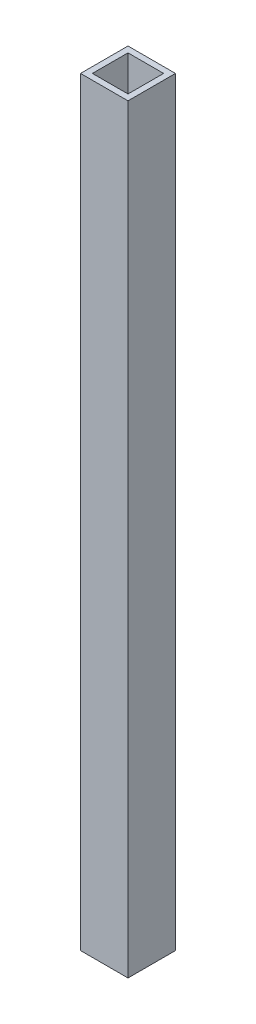
ISO-10303-21;
HEADER;
FILE_DESCRIPTION(('STEP AP214'),'2;1');
FILE_NAME('part.step','',(''),(''),'','','');
FILE_SCHEMA(('AUTOMOTIVE_DESIGN { 1 0 10303 214 1 1 1 1 }'));
ENDSEC;
DATA;
#1=APPLICATION_CONTEXT('core data for automotive mechanical design processes');
#2=APPLICATION_PROTOCOL_DEFINITION('international standard','automotive_design',2000,#1);
#3=PRODUCT_CONTEXT('',#1,'mechanical');
#4=PRODUCT('Part','Part','',(#3));
#5=PRODUCT_RELATED_PRODUCT_CATEGORY('part','',(#4));
#6=PRODUCT_DEFINITION_FORMATION('','',#4);
#7=PRODUCT_DEFINITION_CONTEXT('part definition',#1,'design');
#8=PRODUCT_DEFINITION('design','',#6,#7);
#9=PRODUCT_DEFINITION_SHAPE('','',#8);
#10=(LENGTH_UNIT() NAMED_UNIT(*) SI_UNIT(.MILLI.,.METRE.));
#11=(NAMED_UNIT(*) PLANE_ANGLE_UNIT() SI_UNIT($,.RADIAN.));
#12=(NAMED_UNIT(*) SI_UNIT($,.STERADIAN.) SOLID_ANGLE_UNIT());
#13=UNCERTAINTY_MEASURE_WITH_UNIT(LENGTH_MEASURE(1.E-05),#10,'distance_accuracy_value','');
#14=(GEOMETRIC_REPRESENTATION_CONTEXT(3) GLOBAL_UNCERTAINTY_ASSIGNED_CONTEXT((#13)) GLOBAL_UNIT_ASSIGNED_CONTEXT((#10,
#11,#12)) REPRESENTATION_CONTEXT('',''));
#15=CARTESIAN_POINT('',(0.,0.,0.));
#16=DIRECTION('',(0.,0.,1.));
#17=DIRECTION('',(1.,0.,0.));
#18=AXIS2_PLACEMENT_3D('',#15,#16,#17);
#19=CARTESIAN_POINT('',(13.3088603358404,193.458234626553,12.7));
#20=DIRECTION('',(-1.,0.,0.));
#21=DIRECTION('',(0.,-1.,0.));
#22=AXIS2_PLACEMENT_3D('',#19,#20,#21);
#23=PLANE('',#22);
#24=DIRECTION('',(0.,1.,0.));
#25=VECTOR('',#24,1.);
#26=CARTESIAN_POINT('',(13.3088603358404,193.458234626553,-12.7));
#27=LINE('',#26,#25);
#28=CARTESIAN_POINT('',(13.3088603358404,-212.941765373447,-12.7));
#29=VERTEX_POINT('',#28);
#30=CARTESIAN_POINT('',(13.3088603358404,193.458234626553,-12.7));
#31=VERTEX_POINT('',#30);
#32=EDGE_CURVE('E130',#29,#31,#27,.T.);
#33=ORIENTED_EDGE('',*,*,#32,.T.);
#34=DIRECTION('',(0.,0.,-1.));
#35=VECTOR('',#34,1.);
#36=CARTESIAN_POINT('',(13.3088603358404,193.458234626553,12.7));
#37=LINE('',#36,#35);
#38=CARTESIAN_POINT('',(13.3088603358404,193.458234626553,12.7));
#39=VERTEX_POINT('',#38);
#40=EDGE_CURVE('E11',#39,#31,#37,.T.);
#41=ORIENTED_EDGE('',*,*,#40,.F.);
#42=DIRECTION('',(0.,1.,0.));
#43=VECTOR('',#42,1.);
#44=CARTESIAN_POINT('',(13.3088603358404,193.458234626553,12.7));
#45=LINE('',#44,#43);
#46=CARTESIAN_POINT('',(13.3088603358404,-212.941765373447,12.7));
#47=VERTEX_POINT('',#46);
#48=EDGE_CURVE('E134',#47,#39,#45,.T.);
#49=ORIENTED_EDGE('',*,*,#48,.F.);
#50=DIRECTION('',(0.,0.,-1.));
#51=VECTOR('',#50,1.);
#52=CARTESIAN_POINT('',(13.3088603358404,-212.941765373447,12.7));
#53=LINE('',#52,#51);
#54=EDGE_CURVE('E144',#47,#29,#53,.T.);
#55=ORIENTED_EDGE('',*,*,#54,.T.);
#56=EDGE_LOOP('',(#33,#41,#49,#55));
#57=FACE_BOUND('',#56,.T.);
#58=ADVANCED_FACE('F33',(#57),#23,.F.);
#59=CARTESIAN_POINT('',(-12.0911396641596,193.458234626553,12.7));
#60=DIRECTION('',(0.,-1.,0.));
#61=DIRECTION('',(0.,0.,-1.));
#62=AXIS2_PLACEMENT_3D('',#59,#60,#61);
#63=PLANE('',#62);
#64=DIRECTION('',(-1.,0.,0.));
#65=VECTOR('',#64,1.);
#66=CARTESIAN_POINT('',(10.1338603358409,193.458234626553,9.525));
#67=LINE('',#66,#65);
#68=CARTESIAN_POINT('',(10.1338603358409,193.458234626553,9.525));
#69=VERTEX_POINT('',#68);
#70=CARTESIAN_POINT('',(-8.91613966415911,193.458234626553,9.525));
#71=VERTEX_POINT('',#70);
#72=EDGE_CURVE('E105',#69,#71,#67,.T.);
#73=ORIENTED_EDGE('',*,*,#72,.T.);
#74=DIRECTION('',(0.,0.,-1.));
#75=VECTOR('',#74,1.);
#76=CARTESIAN_POINT('',(-8.91613966415911,193.458234626553,9.525));
#77=LINE('',#76,#75);
#78=CARTESIAN_POINT('',(-8.91613966415911,193.458234626553,-9.525));
#79=VERTEX_POINT('',#78);
#80=EDGE_CURVE('E99',#71,#79,#77,.T.);
#81=ORIENTED_EDGE('',*,*,#80,.T.);
#82=DIRECTION('',(1.,0.,0.));
#83=VECTOR('',#82,1.);
#84=CARTESIAN_POINT('',(-8.91613966415911,193.458234626553,-9.525));
#85=LINE('',#84,#83);
#86=CARTESIAN_POINT('',(10.1338603358409,193.458234626553,-9.525));
#87=VERTEX_POINT('',#86);
#88=EDGE_CURVE('E108',#79,#87,#85,.T.);
#89=ORIENTED_EDGE('',*,*,#88,.T.);
#90=DIRECTION('',(0.,0.,1.));
#91=VECTOR('',#90,1.);
#92=CARTESIAN_POINT('',(10.1338603358409,193.458234626553,-9.525));
#93=LINE('',#92,#91);
#94=EDGE_CURVE('E47',#87,#69,#93,.T.);
#95=ORIENTED_EDGE('',*,*,#94,.T.);
#96=EDGE_LOOP('',(#73,#81,#89,#95));
#97=FACE_BOUND('',#96,.T.);
#98=DIRECTION('',(-1.,0.,0.));
#99=VECTOR('',#98,1.);
#100=CARTESIAN_POINT('',(-12.0911396641596,193.458234626553,-12.7));
#101=LINE('',#100,#99);
#102=CARTESIAN_POINT('',(-12.0911396641596,193.458234626553,-12.7));
#103=VERTEX_POINT('',#102);
#104=EDGE_CURVE('E147',#31,#103,#101,.T.);
#105=ORIENTED_EDGE('',*,*,#104,.T.);
#106=DIRECTION('',(0.,0.,-1.));
#107=VECTOR('',#106,1.);
#108=CARTESIAN_POINT('',(-12.0911396641596,193.458234626553,12.7));
#109=LINE('',#108,#107);
#110=CARTESIAN_POINT('',(-12.0911396641596,193.458234626553,12.7));
#111=VERTEX_POINT('',#110);
#112=EDGE_CURVE('E40',#111,#103,#109,.T.);
#113=ORIENTED_EDGE('',*,*,#112,.F.);
#114=DIRECTION('',(-1.,0.,0.));
#115=VECTOR('',#114,1.);
#116=CARTESIAN_POINT('',(-12.0911396641596,193.458234626553,12.7));
#117=LINE('',#116,#115);
#118=EDGE_CURVE('E137',#39,#111,#117,.T.);
#119=ORIENTED_EDGE('',*,*,#118,.F.);
#120=ORIENTED_EDGE('',*,*,#40,.T.);
#121=EDGE_LOOP('',(#105,#113,#119,#120));
#122=FACE_BOUND('',#121,.T.);
#123=ADVANCED_FACE('F112',(#97,#122),#63,.F.);
#124=CARTESIAN_POINT('',(-12.0911396641596,193.458234626553,12.7));
#125=DIRECTION('',(1.,0.,0.));
#126=DIRECTION('',(0.,1.,0.));
#127=AXIS2_PLACEMENT_3D('',#124,#125,#126);
#128=PLANE('',#127);
#129=DIRECTION('',(0.,-1.,0.));
#130=VECTOR('',#129,1.);
#131=CARTESIAN_POINT('',(-12.0911396641596,193.458234626553,-12.7));
#132=LINE('',#131,#130);
#133=CARTESIAN_POINT('',(-12.0911396641596,-212.941765373447,-12.7));
#134=VERTEX_POINT('',#133);
#135=EDGE_CURVE('E149',#103,#134,#132,.T.);
#136=ORIENTED_EDGE('',*,*,#135,.T.);
#137=DIRECTION('',(0.,0.,-1.));
#138=VECTOR('',#137,1.);
#139=CARTESIAN_POINT('',(-12.0911396641596,-212.941765373447,12.7));
#140=LINE('',#139,#138);
#141=CARTESIAN_POINT('',(-12.0911396641596,-212.941765373447,12.7));
#142=VERTEX_POINT('',#141);
#143=EDGE_CURVE('E154',#142,#134,#140,.T.);
#144=ORIENTED_EDGE('',*,*,#143,.F.);
#145=DIRECTION('',(0.,-1.,0.));
#146=VECTOR('',#145,1.);
#147=CARTESIAN_POINT('',(-12.0911396641596,193.458234626553,12.7));
#148=LINE('',#147,#146);
#149=EDGE_CURVE('E140',#111,#142,#148,.T.);
#150=ORIENTED_EDGE('',*,*,#149,.F.);
#151=ORIENTED_EDGE('',*,*,#112,.T.);
#152=EDGE_LOOP('',(#136,#144,#150,#151));
#153=FACE_BOUND('',#152,.T.);
#154=ADVANCED_FACE('F161',(#153),#128,.F.);
#155=CARTESIAN_POINT('',(-12.0911396641596,-212.941765373447,12.7));
#156=DIRECTION('',(0.,1.,0.));
#157=DIRECTION('',(0.,0.,1.));
#158=AXIS2_PLACEMENT_3D('',#155,#156,#157);
#159=PLANE('',#158);
#160=DIRECTION('',(1.,0.,0.));
#161=VECTOR('',#160,1.);
#162=CARTESIAN_POINT('',(-8.91613966415956,-212.941765373447,-9.525));
#163=LINE('',#162,#161);
#164=CARTESIAN_POINT('',(-8.91613966415956,-212.941765373447,-9.525));
#165=VERTEX_POINT('',#164);
#166=CARTESIAN_POINT('',(10.1338603358404,-212.941765373447,-9.525));
#167=VERTEX_POINT('',#166);
#168=EDGE_CURVE('E124',#165,#167,#163,.T.);
#169=ORIENTED_EDGE('',*,*,#168,.F.);
#170=DIRECTION('',(0.,0.,-1.));
#171=VECTOR('',#170,1.);
#172=CARTESIAN_POINT('',(-8.91613966415956,-212.941765373447,9.525));
#173=LINE('',#172,#171);
#174=CARTESIAN_POINT('',(-8.91613966415956,-212.941765373447,9.525));
#175=VERTEX_POINT('',#174);
#176=EDGE_CURVE('E55',#175,#165,#173,.T.);
#177=ORIENTED_EDGE('',*,*,#176,.F.);
#178=DIRECTION('',(-1.,0.,0.));
#179=VECTOR('',#178,1.);
#180=CARTESIAN_POINT('',(10.1338603358404,-212.941765373447,9.525));
#181=LINE('',#180,#179);
#182=CARTESIAN_POINT('',(10.1338603358404,-212.941765373447,9.525));
#183=VERTEX_POINT('',#182);
#184=EDGE_CURVE('E115',#183,#175,#181,.T.);
#185=ORIENTED_EDGE('',*,*,#184,.F.);
#186=DIRECTION('',(0.,0.,1.));
#187=VECTOR('',#186,1.);
#188=CARTESIAN_POINT('',(10.1338603358404,-212.941765373447,-9.525));
#189=LINE('',#188,#187);
#190=EDGE_CURVE('E118',#167,#183,#189,.T.);
#191=ORIENTED_EDGE('',*,*,#190,.F.);
#192=EDGE_LOOP('',(#169,#177,#185,#191));
#193=FACE_BOUND('',#192,.T.);
#194=DIRECTION('',(1.,0.,0.));
#195=VECTOR('',#194,1.);
#196=CARTESIAN_POINT('',(-12.0911396641596,-212.941765373447,-12.7));
#197=LINE('',#196,#195);
#198=EDGE_CURVE('E138',#134,#29,#197,.T.);
#199=ORIENTED_EDGE('',*,*,#198,.T.);
#200=ORIENTED_EDGE('',*,*,#54,.F.);
#201=DIRECTION('',(1.,0.,0.));
#202=VECTOR('',#201,1.);
#203=CARTESIAN_POINT('',(-12.0911396641596,-212.941765373447,12.7));
#204=LINE('',#203,#202);
#205=EDGE_CURVE('E142',#142,#47,#204,.T.);
#206=ORIENTED_EDGE('',*,*,#205,.F.);
#207=ORIENTED_EDGE('',*,*,#143,.T.);
#208=EDGE_LOOP('',(#199,#200,#206,#207));
#209=FACE_BOUND('',#208,.T.);
#210=ADVANCED_FACE('F169',(#193,#209),#159,.F.);
#211=CARTESIAN_POINT('',(0.,0.,12.7));
#212=DIRECTION('',(0.,0.,1.));
#213=DIRECTION('',(1.,0.,0.));
#214=AXIS2_PLACEMENT_3D('',#211,#212,#213);
#215=PLANE('',#214);
#216=ORIENTED_EDGE('',*,*,#48,.T.);
#217=ORIENTED_EDGE('',*,*,#118,.T.);
#218=ORIENTED_EDGE('',*,*,#149,.T.);
#219=ORIENTED_EDGE('',*,*,#205,.T.);
#220=EDGE_LOOP('',(#216,#217,#218,#219));
#221=FACE_BOUND('',#220,.T.);
#222=ADVANCED_FACE('F175',(#221),#215,.T.);
#223=CARTESIAN_POINT('',(0.,0.,-12.7));
#224=DIRECTION('',(0.,0.,1.));
#225=DIRECTION('',(1.,0.,0.));
#226=AXIS2_PLACEMENT_3D('',#223,#224,#225);
#227=PLANE('',#226);
#228=ORIENTED_EDGE('',*,*,#32,.F.);
#229=ORIENTED_EDGE('',*,*,#198,.F.);
#230=ORIENTED_EDGE('',*,*,#135,.F.);
#231=ORIENTED_EDGE('',*,*,#104,.F.);
#232=EDGE_LOOP('',(#228,#229,#230,#231));
#233=FACE_BOUND('',#232,.T.);
#234=ADVANCED_FACE('F166',(#233),#227,.F.);
#235=CARTESIAN_POINT('',(-8.91613966415911,193.458234626553,9.525));
#236=DIRECTION('',(-1.,0.,0.));
#237=DIRECTION('',(0.,-1.,0.));
#238=AXIS2_PLACEMENT_3D('',#235,#236,#237);
#239=PLANE('',#238);
#240=ORIENTED_EDGE('',*,*,#176,.T.);
#241=DIRECTION('',(0.,-1.,0.));
#242=VECTOR('',#241,1.);
#243=CARTESIAN_POINT('',(-8.91613966415911,193.458234626553,-9.525));
#244=LINE('',#243,#242);
#245=EDGE_CURVE('E95',#79,#165,#244,.T.);
#246=ORIENTED_EDGE('',*,*,#245,.F.);
#247=ORIENTED_EDGE('',*,*,#80,.F.);
#248=DIRECTION('',(0.,-1.,0.));
#249=VECTOR('',#248,1.);
#250=CARTESIAN_POINT('',(-8.91613966415911,193.458234626553,9.525));
#251=LINE('',#250,#249);
#252=EDGE_CURVE('E128',#71,#175,#251,.T.);
#253=ORIENTED_EDGE('',*,*,#252,.T.);
#254=EDGE_LOOP('',(#240,#246,#247,#253));
#255=FACE_BOUND('',#254,.T.);
#256=ADVANCED_FACE('F97',(#255),#239,.F.);
#257=CARTESIAN_POINT('',(10.1338603358409,193.458234626553,9.525));
#258=DIRECTION('',(0.,0.,1.));
#259=DIRECTION('',(1.,0.,0.));
#260=AXIS2_PLACEMENT_3D('',#257,#258,#259);
#261=PLANE('',#260);
#262=ORIENTED_EDGE('',*,*,#184,.T.);
#263=ORIENTED_EDGE('',*,*,#252,.F.);
#264=ORIENTED_EDGE('',*,*,#72,.F.);
#265=DIRECTION('',(0.,-1.,0.));
#266=VECTOR('',#265,1.);
#267=CARTESIAN_POINT('',(10.1338603358409,193.458234626553,9.525));
#268=LINE('',#267,#266);
#269=EDGE_CURVE('E131',#69,#183,#268,.T.);
#270=ORIENTED_EDGE('',*,*,#269,.T.);
#271=EDGE_LOOP('',(#262,#263,#264,#270));
#272=FACE_BOUND('',#271,.T.);
#273=ADVANCED_FACE('F192',(#272),#261,.F.);
#274=CARTESIAN_POINT('',(10.1338603358409,193.458234626553,-9.525));
#275=DIRECTION('',(1.,0.,0.));
#276=DIRECTION('',(0.,1.,0.));
#277=AXIS2_PLACEMENT_3D('',#274,#275,#276);
#278=PLANE('',#277);
#279=ORIENTED_EDGE('',*,*,#190,.T.);
#280=ORIENTED_EDGE('',*,*,#269,.F.);
#281=ORIENTED_EDGE('',*,*,#94,.F.);
#282=DIRECTION('',(0.,-1.,0.));
#283=VECTOR('',#282,1.);
#284=CARTESIAN_POINT('',(10.1338603358409,193.458234626553,-9.525));
#285=LINE('',#284,#283);
#286=EDGE_CURVE('E104',#87,#167,#285,.T.);
#287=ORIENTED_EDGE('',*,*,#286,.T.);
#288=EDGE_LOOP('',(#279,#280,#281,#287));
#289=FACE_BOUND('',#288,.T.);
#290=ADVANCED_FACE('F195',(#289),#278,.F.);
#291=CARTESIAN_POINT('',(-8.91613966415911,193.458234626553,-9.525));
#292=DIRECTION('',(0.,0.,-1.));
#293=DIRECTION('',(-1.,0.,0.));
#294=AXIS2_PLACEMENT_3D('',#291,#292,#293);
#295=PLANE('',#294);
#296=ORIENTED_EDGE('',*,*,#168,.T.);
#297=ORIENTED_EDGE('',*,*,#286,.F.);
#298=ORIENTED_EDGE('',*,*,#88,.F.);
#299=ORIENTED_EDGE('',*,*,#245,.T.);
#300=EDGE_LOOP('',(#296,#297,#298,#299));
#301=FACE_BOUND('',#300,.T.);
#302=ADVANCED_FACE('F109',(#301),#295,.F.);
#303=CLOSED_SHELL('',(#58,#123,#154,#210,#222,#234,#256,#273,#290,#302));
#304=MANIFOLD_SOLID_BREP('B2',#303);
#305=ADVANCED_BREP_SHAPE_REPRESENTATION('',(#18,#304),#14);
#306=SHAPE_DEFINITION_REPRESENTATION(#9,#305);
ENDSEC;
END-ISO-10303-21;
